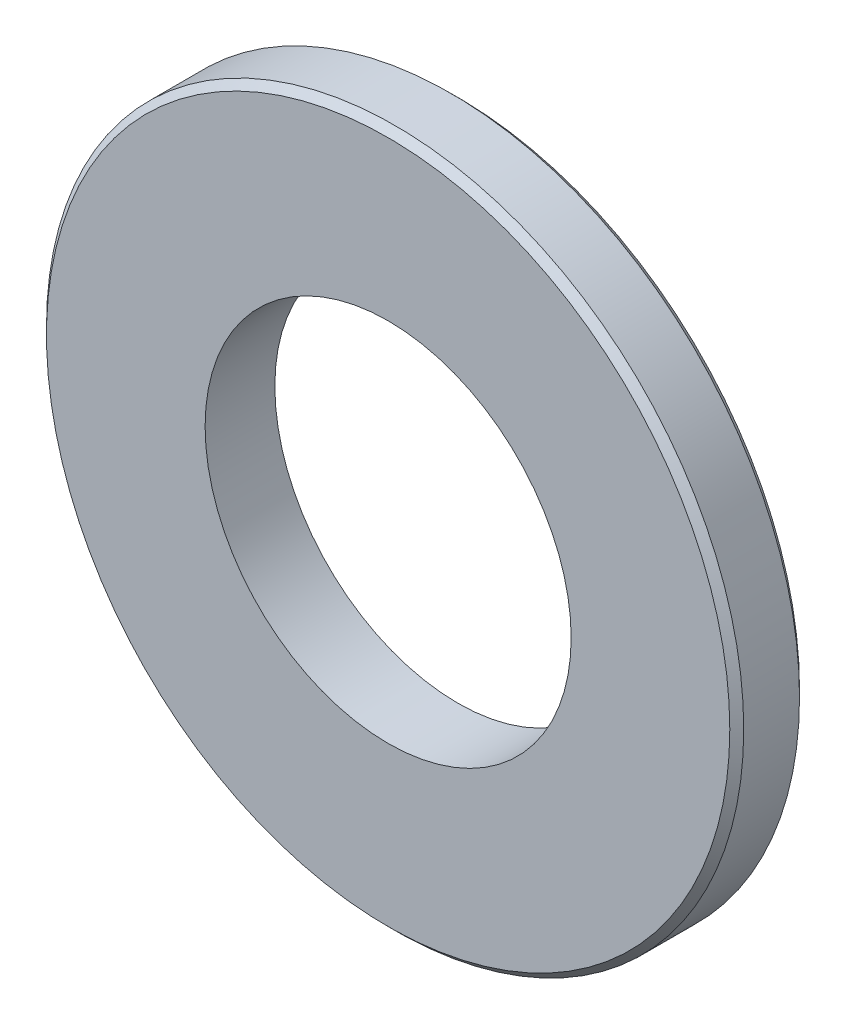
ISO-10303-21;
HEADER;
FILE_DESCRIPTION(('STEP AP214'),'2;1');
FILE_NAME('part.step','',(''),(''),'','','');
FILE_SCHEMA(('AUTOMOTIVE_DESIGN { 1 0 10303 214 1 1 1 1 }'));
ENDSEC;
DATA;
#1=APPLICATION_CONTEXT('core data for automotive mechanical design processes');
#2=APPLICATION_PROTOCOL_DEFINITION('international standard','automotive_design',2000,#1);
#3=PRODUCT_CONTEXT('',#1,'mechanical');
#4=PRODUCT('Part','Part','',(#3));
#5=PRODUCT_RELATED_PRODUCT_CATEGORY('part','',(#4));
#6=PRODUCT_DEFINITION_FORMATION('','',#4);
#7=PRODUCT_DEFINITION_CONTEXT('part definition',#1,'design');
#8=PRODUCT_DEFINITION('design','',#6,#7);
#9=PRODUCT_DEFINITION_SHAPE('','',#8);
#10=(LENGTH_UNIT() NAMED_UNIT(*) SI_UNIT(.MILLI.,.METRE.));
#11=(NAMED_UNIT(*) PLANE_ANGLE_UNIT() SI_UNIT($,.RADIAN.));
#12=(NAMED_UNIT(*) SI_UNIT($,.STERADIAN.) SOLID_ANGLE_UNIT());
#13=UNCERTAINTY_MEASURE_WITH_UNIT(LENGTH_MEASURE(1.E-05),#10,'distance_accuracy_value','');
#14=(GEOMETRIC_REPRESENTATION_CONTEXT(3) GLOBAL_UNCERTAINTY_ASSIGNED_CONTEXT((#13)) GLOBAL_UNIT_ASSIGNED_CONTEXT((#10,
#11,#12)) REPRESENTATION_CONTEXT('',''));
#15=CARTESIAN_POINT('',(0.,0.,0.));
#16=DIRECTION('',(0.,0.,1.));
#17=DIRECTION('',(1.,0.,0.));
#18=AXIS2_PLACEMENT_3D('',#15,#16,#17);
#19=CARTESIAN_POINT('',(0.,0.,2.));
#20=DIRECTION('',(0.,0.,1.));
#21=DIRECTION('',(1.,0.,0.));
#22=AXIS2_PLACEMENT_3D('',#19,#20,#21);
#23=PLANE('',#22);
#24=CARTESIAN_POINT('',(0.,0.,2.));
#25=DIRECTION('',(0.,0.,1.));
#26=DIRECTION('',(1.,0.,0.));
#27=AXIS2_PLACEMENT_3D('',#24,#25,#26);
#28=CIRCLE('',#27,9.79999999999999);
#29=CARTESIAN_POINT('',(9.79999999999999,0.,2.));
#30=VERTEX_POINT('',#29);
#31=EDGE_CURVE('E10',#30,#30,#28,.T.);
#32=ORIENTED_EDGE('',*,*,#31,.T.);
#33=EDGE_LOOP('',(#32));
#34=FACE_BOUND('',#33,.T.);
#35=CARTESIAN_POINT('',(0.,0.,2.));
#36=DIRECTION('',(0.,0.,1.));
#37=DIRECTION('',(1.,0.,0.));
#38=AXIS2_PLACEMENT_3D('',#35,#36,#37);
#39=CIRCLE('',#38,5.25);
#40=CARTESIAN_POINT('',(5.25,0.,2.));
#41=VERTEX_POINT('',#40);
#42=EDGE_CURVE('E60',#41,#41,#39,.T.);
#43=ORIENTED_EDGE('',*,*,#42,.F.);
#44=EDGE_LOOP('',(#43));
#45=FACE_BOUND('',#44,.T.);
#46=ADVANCED_FACE('F40',(#34,#45),#23,.T.);
#47=CARTESIAN_POINT('',(0.,0.,0.));
#48=DIRECTION('',(0.,0.,1.));
#49=DIRECTION('',(1.,0.,0.));
#50=AXIS2_PLACEMENT_3D('',#47,#48,#49);
#51=PLANE('',#50);
#52=CARTESIAN_POINT('',(0.,0.,0.));
#53=DIRECTION('',(0.,0.,1.));
#54=DIRECTION('',(1.,0.,0.));
#55=AXIS2_PLACEMENT_3D('',#52,#53,#54);
#56=CIRCLE('',#55,9.8);
#57=CARTESIAN_POINT('',(9.8,0.,0.));
#58=VERTEX_POINT('',#57);
#59=EDGE_CURVE('E47',#58,#58,#56,.F.);
#60=ORIENTED_EDGE('',*,*,#59,.T.);
#61=EDGE_LOOP('',(#60));
#62=FACE_BOUND('',#61,.T.);
#63=CARTESIAN_POINT('',(0.,0.,0.));
#64=DIRECTION('',(0.,0.,1.));
#65=DIRECTION('',(1.,0.,0.));
#66=AXIS2_PLACEMENT_3D('',#63,#64,#65);
#67=CIRCLE('',#66,5.25);
#68=CARTESIAN_POINT('',(5.25,0.,0.));
#69=VERTEX_POINT('',#68);
#70=EDGE_CURVE('E61',#69,#69,#67,.T.);
#71=ORIENTED_EDGE('',*,*,#70,.T.);
#72=EDGE_LOOP('',(#71));
#73=FACE_BOUND('',#72,.T.);
#74=ADVANCED_FACE('F71',(#62,#73),#51,.F.);
#75=CARTESIAN_POINT('',(0.,0.,2.));
#76=DIRECTION('',(0.,0.,-1.));
#77=DIRECTION('',(-1.,0.,0.));
#78=AXIS2_PLACEMENT_3D('',#75,#76,#77);
#79=CYLINDRICAL_SURFACE('',#78,10.);
#80=CARTESIAN_POINT('',(0.,0.,0.200000000000001));
#81=DIRECTION('',(0.,0.,1.));
#82=DIRECTION('',(1.,0.,0.));
#83=AXIS2_PLACEMENT_3D('',#80,#81,#82);
#84=CIRCLE('',#83,10.);
#85=CARTESIAN_POINT('',(10.,0.,0.200000000000001));
#86=VERTEX_POINT('',#85);
#87=EDGE_CURVE('E51',#86,#86,#84,.T.);
#88=ORIENTED_EDGE('',*,*,#87,.T.);
#89=EDGE_LOOP('',(#88));
#90=FACE_BOUND('',#89,.T.);
#91=CARTESIAN_POINT('',(0.,0.,1.79999999999999));
#92=DIRECTION('',(0.,0.,1.));
#93=DIRECTION('',(1.,0.,0.));
#94=AXIS2_PLACEMENT_3D('',#91,#92,#93);
#95=CIRCLE('',#94,10.);
#96=CARTESIAN_POINT('',(10.,0.,1.79999999999999));
#97=VERTEX_POINT('',#96);
#98=EDGE_CURVE('E55',#97,#97,#95,.F.);
#99=ORIENTED_EDGE('',*,*,#98,.T.);
#100=EDGE_LOOP('',(#99));
#101=FACE_BOUND('',#100,.T.);
#102=ADVANCED_FACE('F76',(#90,#101),#79,.T.);
#103=CARTESIAN_POINT('',(0.,0.,2.));
#104=DIRECTION('',(0.,0.,-1.));
#105=DIRECTION('',(-1.,0.,0.));
#106=AXIS2_PLACEMENT_3D('',#103,#104,#105);
#107=CYLINDRICAL_SURFACE('',#106,5.25);
#108=ORIENTED_EDGE('',*,*,#42,.T.);
#109=EDGE_LOOP('',(#108));
#110=FACE_BOUND('',#109,.T.);
#111=ORIENTED_EDGE('',*,*,#70,.F.);
#112=EDGE_LOOP('',(#111));
#113=FACE_BOUND('',#112,.T.);
#114=ADVANCED_FACE('F67',(#110,#113),#107,.F.);
#115=CARTESIAN_POINT('',(0.,0.,0.200000000000001));
#116=DIRECTION('',(0.,0.,1.));
#117=DIRECTION('',(1.,0.,0.));
#118=AXIS2_PLACEMENT_3D('',#115,#116,#117);
#119=CONICAL_SURFACE('',#118,10.,0.785398163397448);
#120=ORIENTED_EDGE('',*,*,#59,.F.);
#121=EDGE_LOOP('',(#120));
#122=FACE_BOUND('',#121,.T.);
#123=ORIENTED_EDGE('',*,*,#87,.F.);
#124=EDGE_LOOP('',(#123));
#125=FACE_BOUND('',#124,.T.);
#126=ADVANCED_FACE('F82',(#122,#125),#119,.T.);
#127=CARTESIAN_POINT('',(0.,0.,2.));
#128=DIRECTION('',(0.,0.,-1.));
#129=DIRECTION('',(-1.,0.,0.));
#130=AXIS2_PLACEMENT_3D('',#127,#128,#129);
#131=CONICAL_SURFACE('',#130,9.79999999999999,0.785398163397448);
#132=ORIENTED_EDGE('',*,*,#98,.F.);
#133=EDGE_LOOP('',(#132));
#134=FACE_BOUND('',#133,.T.);
#135=ORIENTED_EDGE('',*,*,#31,.F.);
#136=EDGE_LOOP('',(#135));
#137=FACE_BOUND('',#136,.T.);
#138=ADVANCED_FACE('F42',(#134,#137),#131,.T.);
#139=CLOSED_SHELL('',(#46,#74,#102,#114,#126,#138));
#140=MANIFOLD_SOLID_BREP('B2',#139);
#141=ADVANCED_BREP_SHAPE_REPRESENTATION('',(#18,#140),#14);
#142=SHAPE_DEFINITION_REPRESENTATION(#9,#141);
ENDSEC;
END-ISO-10303-21;
